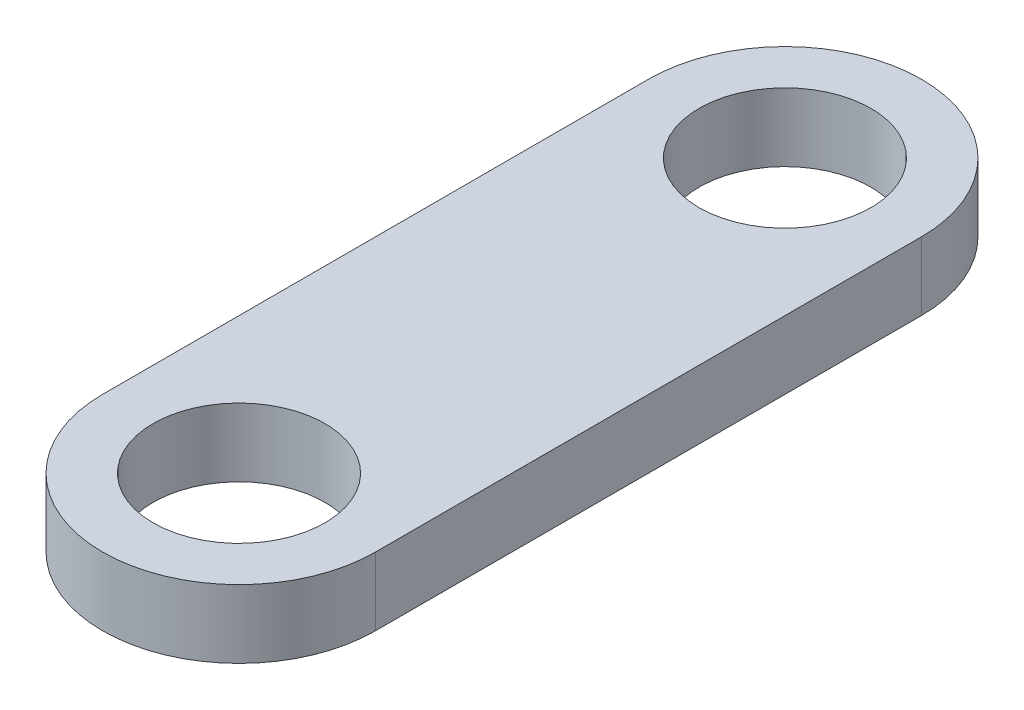
ISO-10303-21;
HEADER;
FILE_DESCRIPTION(('STEP AP214'),'2;1');
FILE_NAME('part.step','',(''),(''),'','','');
FILE_SCHEMA(('AUTOMOTIVE_DESIGN { 1 0 10303 214 1 1 1 1 }'));
ENDSEC;
DATA;
#1=APPLICATION_CONTEXT('core data for automotive mechanical design processes');
#2=APPLICATION_PROTOCOL_DEFINITION('international standard','automotive_design',2000,#1);
#3=PRODUCT_CONTEXT('',#1,'mechanical');
#4=PRODUCT('Part','Part','',(#3));
#5=PRODUCT_RELATED_PRODUCT_CATEGORY('part','',(#4));
#6=PRODUCT_DEFINITION_FORMATION('','',#4);
#7=PRODUCT_DEFINITION_CONTEXT('part definition',#1,'design');
#8=PRODUCT_DEFINITION('design','',#6,#7);
#9=PRODUCT_DEFINITION_SHAPE('','',#8);
#10=(LENGTH_UNIT() NAMED_UNIT(*) SI_UNIT(.MILLI.,.METRE.));
#11=(NAMED_UNIT(*) PLANE_ANGLE_UNIT() SI_UNIT($,.RADIAN.));
#12=(NAMED_UNIT(*) SI_UNIT($,.STERADIAN.) SOLID_ANGLE_UNIT());
#13=UNCERTAINTY_MEASURE_WITH_UNIT(LENGTH_MEASURE(1.E-05),#10,'distance_accuracy_value','');
#14=(GEOMETRIC_REPRESENTATION_CONTEXT(3) GLOBAL_UNCERTAINTY_ASSIGNED_CONTEXT((#13)) GLOBAL_UNIT_ASSIGNED_CONTEXT((#10,
#11,#12)) REPRESENTATION_CONTEXT('',''));
#15=CARTESIAN_POINT('',(0.,0.,0.));
#16=DIRECTION('',(0.,0.,1.));
#17=DIRECTION('',(1.,0.,0.));
#18=AXIS2_PLACEMENT_3D('',#15,#16,#17);
#19=CARTESIAN_POINT('',(0.,1.5875,0.));
#20=DIRECTION('',(0.,-1.,0.));
#21=DIRECTION('',(0.,0.,-1.));
#22=AXIS2_PLACEMENT_3D('',#19,#20,#21);
#23=PLANE('',#22);
#24=CARTESIAN_POINT('',(0.,1.5875,0.));
#25=DIRECTION('',(0.,1.,0.));
#26=DIRECTION('',(0.,0.,-1.));
#27=AXIS2_PLACEMENT_3D('',#24,#25,#26);
#28=CIRCLE('',#27,3.175);
#29=CARTESIAN_POINT('',(3.175,1.5875,0.));
#30=VERTEX_POINT('',#29);
#31=CARTESIAN_POINT('',(-3.175,1.5875,0.));
#32=VERTEX_POINT('',#31);
#33=EDGE_CURVE('E92',#30,#32,#28,.T.);
#34=ORIENTED_EDGE('',*,*,#33,.T.);
#35=DIRECTION('',(0.,0.,1.));
#36=VECTOR('',#35,1.);
#37=CARTESIAN_POINT('',(-3.175,1.5875,0.));
#38=LINE('',#37,#36);
#39=CARTESIAN_POINT('',(-3.175,1.5875,12.7));
#40=VERTEX_POINT('',#39);
#41=EDGE_CURVE('E87',#32,#40,#38,.T.);
#42=ORIENTED_EDGE('',*,*,#41,.T.);
#43=CARTESIAN_POINT('',(0.,1.5875,12.7));
#44=DIRECTION('',(0.,1.,0.));
#45=DIRECTION('',(0.,0.,-1.));
#46=AXIS2_PLACEMENT_3D('',#43,#44,#45);
#47=CIRCLE('',#46,3.175);
#48=CARTESIAN_POINT('',(3.175,1.5875,12.7));
#49=VERTEX_POINT('',#48);
#50=EDGE_CURVE('E90',#40,#49,#47,.T.);
#51=ORIENTED_EDGE('',*,*,#50,.T.);
#52=DIRECTION('',(0.,0.,-1.));
#53=VECTOR('',#52,1.);
#54=CARTESIAN_POINT('',(3.175,1.5875,0.));
#55=LINE('',#54,#53);
#56=EDGE_CURVE('E57',#49,#30,#55,.T.);
#57=ORIENTED_EDGE('',*,*,#56,.T.);
#58=EDGE_LOOP('',(#34,#42,#51,#57));
#59=FACE_BOUND('',#58,.T.);
#60=CARTESIAN_POINT('',(0.,1.5875,0.));
#61=DIRECTION('',(0.,1.,0.));
#62=DIRECTION('',(0.,0.,1.));
#63=AXIS2_PLACEMENT_3D('',#60,#61,#62);
#64=CIRCLE('',#63,2.);
#65=CARTESIAN_POINT('',(0.,1.5875,2.));
#66=VERTEX_POINT('',#65);
#67=EDGE_CURVE('E112',#66,#66,#64,.T.);
#68=ORIENTED_EDGE('',*,*,#67,.F.);
#69=EDGE_LOOP('',(#68));
#70=FACE_BOUND('',#69,.T.);
#71=CARTESIAN_POINT('',(0.,1.5875,12.7));
#72=DIRECTION('',(0.,1.,0.));
#73=DIRECTION('',(0.,0.,1.));
#74=AXIS2_PLACEMENT_3D('',#71,#72,#73);
#75=CIRCLE('',#74,2.);
#76=CARTESIAN_POINT('',(0.,1.5875,14.7));
#77=VERTEX_POINT('',#76);
#78=EDGE_CURVE('E134',#77,#77,#75,.T.);
#79=ORIENTED_EDGE('',*,*,#78,.F.);
#80=EDGE_LOOP('',(#79));
#81=FACE_BOUND('',#80,.T.);
#82=ADVANCED_FACE('F39',(#59,#70,#81),#23,.F.);
#83=CARTESIAN_POINT('',(0.,0.,0.));
#84=DIRECTION('',(0.,-1.,0.));
#85=DIRECTION('',(0.,0.,-1.));
#86=AXIS2_PLACEMENT_3D('',#83,#84,#85);
#87=PLANE('',#86);
#88=CARTESIAN_POINT('',(0.,0.,0.));
#89=DIRECTION('',(0.,1.,0.));
#90=DIRECTION('',(0.,0.,1.));
#91=AXIS2_PLACEMENT_3D('',#88,#89,#90);
#92=CIRCLE('',#91,2.);
#93=CARTESIAN_POINT('',(0.,0.,2.));
#94=VERTEX_POINT('',#93);
#95=EDGE_CURVE('E130',#94,#94,#92,.T.);
#96=ORIENTED_EDGE('',*,*,#95,.T.);
#97=EDGE_LOOP('',(#96));
#98=FACE_BOUND('',#97,.T.);
#99=CARTESIAN_POINT('',(0.,0.,0.));
#100=DIRECTION('',(0.,1.,0.));
#101=DIRECTION('',(0.,0.,-1.));
#102=AXIS2_PLACEMENT_3D('',#99,#100,#101);
#103=CIRCLE('',#102,3.175);
#104=CARTESIAN_POINT('',(3.175,0.,0.));
#105=VERTEX_POINT('',#104);
#106=CARTESIAN_POINT('',(-3.175,0.,0.));
#107=VERTEX_POINT('',#106);
#108=EDGE_CURVE('E108',#105,#107,#103,.T.);
#109=ORIENTED_EDGE('',*,*,#108,.F.);
#110=DIRECTION('',(0.,0.,-1.));
#111=VECTOR('',#110,1.);
#112=CARTESIAN_POINT('',(3.175,0.,0.));
#113=LINE('',#112,#111);
#114=CARTESIAN_POINT('',(3.175,0.,12.7));
#115=VERTEX_POINT('',#114);
#116=EDGE_CURVE('E80',#115,#105,#113,.T.);
#117=ORIENTED_EDGE('',*,*,#116,.F.);
#118=CARTESIAN_POINT('',(0.,0.,12.7));
#119=DIRECTION('',(0.,1.,0.));
#120=DIRECTION('',(0.,0.,-1.));
#121=AXIS2_PLACEMENT_3D('',#118,#119,#120);
#122=CIRCLE('',#121,3.175);
#123=CARTESIAN_POINT('',(-3.175,0.,12.7));
#124=VERTEX_POINT('',#123);
#125=EDGE_CURVE('E74',#124,#115,#122,.T.);
#126=ORIENTED_EDGE('',*,*,#125,.F.);
#127=DIRECTION('',(0.,0.,1.));
#128=VECTOR('',#127,1.);
#129=CARTESIAN_POINT('',(-3.175,0.,0.));
#130=LINE('',#129,#128);
#131=EDGE_CURVE('E97',#107,#124,#130,.T.);
#132=ORIENTED_EDGE('',*,*,#131,.F.);
#133=EDGE_LOOP('',(#109,#117,#126,#132));
#134=FACE_BOUND('',#133,.T.);
#135=CARTESIAN_POINT('',(0.,0.,12.7));
#136=DIRECTION('',(0.,1.,0.));
#137=DIRECTION('',(0.,0.,1.));
#138=AXIS2_PLACEMENT_3D('',#135,#136,#137);
#139=CIRCLE('',#138,2.);
#140=CARTESIAN_POINT('',(0.,0.,14.7));
#141=VERTEX_POINT('',#140);
#142=EDGE_CURVE('E138',#141,#141,#139,.T.);
#143=ORIENTED_EDGE('',*,*,#142,.T.);
#144=EDGE_LOOP('',(#143));
#145=FACE_BOUND('',#144,.T.);
#146=ADVANCED_FACE('F125',(#98,#134,#145),#87,.T.);
#147=CARTESIAN_POINT('',(0.,1.5875,0.));
#148=DIRECTION('',(0.,-1.,0.));
#149=DIRECTION('',(0.,0.,-1.));
#150=AXIS2_PLACEMENT_3D('',#147,#148,#149);
#151=CYLINDRICAL_SURFACE('',#150,3.175);
#152=ORIENTED_EDGE('',*,*,#108,.T.);
#153=DIRECTION('',(0.,-1.,0.));
#154=VECTOR('',#153,1.);
#155=CARTESIAN_POINT('',(-3.175,1.5875,0.));
#156=LINE('',#155,#154);
#157=EDGE_CURVE('E11',#32,#107,#156,.T.);
#158=ORIENTED_EDGE('',*,*,#157,.F.);
#159=ORIENTED_EDGE('',*,*,#33,.F.);
#160=DIRECTION('',(0.,-1.,0.));
#161=VECTOR('',#160,1.);
#162=CARTESIAN_POINT('',(3.175,1.5875,0.));
#163=LINE('',#162,#161);
#164=EDGE_CURVE('E104',#30,#105,#163,.T.);
#165=ORIENTED_EDGE('',*,*,#164,.T.);
#166=EDGE_LOOP('',(#152,#158,#159,#165));
#167=FACE_BOUND('',#166,.T.);
#168=ADVANCED_FACE('F41',(#167),#151,.T.);
#169=CARTESIAN_POINT('',(-3.175,1.5875,0.));
#170=DIRECTION('',(1.,0.,0.));
#171=DIRECTION('',(0.,0.,-1.));
#172=AXIS2_PLACEMENT_3D('',#169,#170,#171);
#173=PLANE('',#172);
#174=ORIENTED_EDGE('',*,*,#131,.T.);
#175=DIRECTION('',(0.,-1.,0.));
#176=VECTOR('',#175,1.);
#177=CARTESIAN_POINT('',(-3.175,1.5875,12.7));
#178=LINE('',#177,#176);
#179=EDGE_CURVE('E49',#40,#124,#178,.T.);
#180=ORIENTED_EDGE('',*,*,#179,.F.);
#181=ORIENTED_EDGE('',*,*,#41,.F.);
#182=ORIENTED_EDGE('',*,*,#157,.T.);
#183=EDGE_LOOP('',(#174,#180,#181,#182));
#184=FACE_BOUND('',#183,.T.);
#185=ADVANCED_FACE('F96',(#184),#173,.F.);
#186=CARTESIAN_POINT('',(0.,1.5875,12.7));
#187=DIRECTION('',(0.,-1.,0.));
#188=DIRECTION('',(0.,0.,-1.));
#189=AXIS2_PLACEMENT_3D('',#186,#187,#188);
#190=CYLINDRICAL_SURFACE('',#189,3.175);
#191=ORIENTED_EDGE('',*,*,#125,.T.);
#192=DIRECTION('',(0.,-1.,0.));
#193=VECTOR('',#192,1.);
#194=CARTESIAN_POINT('',(3.175,1.5875,12.7));
#195=LINE('',#194,#193);
#196=EDGE_CURVE('E99',#49,#115,#195,.T.);
#197=ORIENTED_EDGE('',*,*,#196,.F.);
#198=ORIENTED_EDGE('',*,*,#50,.F.);
#199=ORIENTED_EDGE('',*,*,#179,.T.);
#200=EDGE_LOOP('',(#191,#197,#198,#199));
#201=FACE_BOUND('',#200,.T.);
#202=ADVANCED_FACE('F100',(#201),#190,.T.);
#203=CARTESIAN_POINT('',(3.175,1.5875,0.));
#204=DIRECTION('',(-1.,0.,0.));
#205=DIRECTION('',(0.,0.,1.));
#206=AXIS2_PLACEMENT_3D('',#203,#204,#205);
#207=PLANE('',#206);
#208=ORIENTED_EDGE('',*,*,#116,.T.);
#209=ORIENTED_EDGE('',*,*,#164,.F.);
#210=ORIENTED_EDGE('',*,*,#56,.F.);
#211=ORIENTED_EDGE('',*,*,#196,.T.);
#212=EDGE_LOOP('',(#208,#209,#210,#211));
#213=FACE_BOUND('',#212,.T.);
#214=ADVANCED_FACE('F122',(#213),#207,.F.);
#215=CARTESIAN_POINT('',(0.,1.5875,0.));
#216=DIRECTION('',(0.,-1.,0.));
#217=DIRECTION('',(0.,0.,-1.));
#218=AXIS2_PLACEMENT_3D('',#215,#216,#217);
#219=CYLINDRICAL_SURFACE('',#218,2.);
#220=ORIENTED_EDGE('',*,*,#67,.T.);
#221=EDGE_LOOP('',(#220));
#222=FACE_BOUND('',#221,.T.);
#223=ORIENTED_EDGE('',*,*,#95,.F.);
#224=EDGE_LOOP('',(#223));
#225=FACE_BOUND('',#224,.T.);
#226=ADVANCED_FACE('F157',(#222,#225),#219,.F.);
#227=CARTESIAN_POINT('',(0.,1.5875,12.7));
#228=DIRECTION('',(0.,-1.,0.));
#229=DIRECTION('',(0.,0.,-1.));
#230=AXIS2_PLACEMENT_3D('',#227,#228,#229);
#231=CYLINDRICAL_SURFACE('',#230,2.);
#232=ORIENTED_EDGE('',*,*,#78,.T.);
#233=EDGE_LOOP('',(#232));
#234=FACE_BOUND('',#233,.T.);
#235=ORIENTED_EDGE('',*,*,#142,.F.);
#236=EDGE_LOOP('',(#235));
#237=FACE_BOUND('',#236,.T.);
#238=ADVANCED_FACE('F146',(#234,#237),#231,.F.);
#239=CLOSED_SHELL('',(#82,#146,#168,#185,#202,#214,#226,#238));
#240=MANIFOLD_SOLID_BREP('B2',#239);
#241=ADVANCED_BREP_SHAPE_REPRESENTATION('',(#18,#240),#14);
#242=SHAPE_DEFINITION_REPRESENTATION(#9,#241);
ENDSEC;
END-ISO-10303-21;
